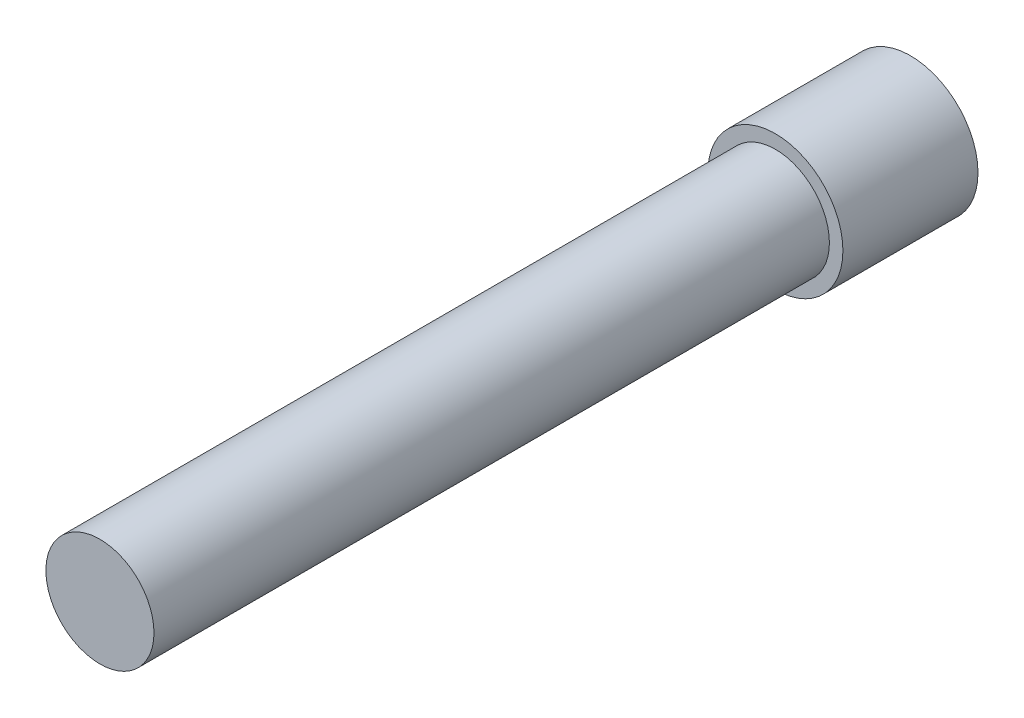
ISO-10303-21;
HEADER;
FILE_DESCRIPTION(('STEP AP214'),'2;1');
FILE_NAME('part.step','',(''),(''),'','','');
FILE_SCHEMA(('AUTOMOTIVE_DESIGN { 1 0 10303 214 1 1 1 1 }'));
ENDSEC;
DATA;
#1=APPLICATION_CONTEXT('core data for automotive mechanical design processes');
#2=APPLICATION_PROTOCOL_DEFINITION('international standard','automotive_design',2000,#1);
#3=PRODUCT_CONTEXT('',#1,'mechanical');
#4=PRODUCT('Part','Part','',(#3));
#5=PRODUCT_RELATED_PRODUCT_CATEGORY('part','',(#4));
#6=PRODUCT_DEFINITION_FORMATION('','',#4);
#7=PRODUCT_DEFINITION_CONTEXT('part definition',#1,'design');
#8=PRODUCT_DEFINITION('design','',#6,#7);
#9=PRODUCT_DEFINITION_SHAPE('','',#8);
#10=(LENGTH_UNIT() NAMED_UNIT(*) SI_UNIT(.MILLI.,.METRE.));
#11=(NAMED_UNIT(*) PLANE_ANGLE_UNIT() SI_UNIT($,.RADIAN.));
#12=(NAMED_UNIT(*) SI_UNIT($,.STERADIAN.) SOLID_ANGLE_UNIT());
#13=UNCERTAINTY_MEASURE_WITH_UNIT(LENGTH_MEASURE(1.E-05),#10,'distance_accuracy_value','');
#14=(GEOMETRIC_REPRESENTATION_CONTEXT(3) GLOBAL_UNCERTAINTY_ASSIGNED_CONTEXT((#13)) GLOBAL_UNIT_ASSIGNED_CONTEXT((#10,
#11,#12)) REPRESENTATION_CONTEXT('',''));
#15=CARTESIAN_POINT('',(0.,0.,0.));
#16=DIRECTION('',(0.,0.,1.));
#17=DIRECTION('',(1.,0.,0.));
#18=AXIS2_PLACEMENT_3D('',#15,#16,#17);
#19=CARTESIAN_POINT('',(0.,0.,0.));
#20=DIRECTION('',(0.,0.,1.));
#21=DIRECTION('',(1.,0.,0.));
#22=AXIS2_PLACEMENT_3D('',#19,#20,#21);
#23=PLANE('',#22);
#24=CARTESIAN_POINT('',(0.,0.,0.));
#25=DIRECTION('',(0.,0.,1.));
#26=DIRECTION('',(1.,0.,0.));
#27=AXIS2_PLACEMENT_3D('',#24,#25,#26);
#28=CIRCLE('',#27,4.);
#29=CARTESIAN_POINT('',(4.,0.,0.));
#30=VERTEX_POINT('',#29);
#31=EDGE_CURVE('E10',#30,#30,#28,.T.);
#32=ORIENTED_EDGE('',*,*,#31,.T.);
#33=EDGE_LOOP('',(#32));
#34=FACE_BOUND('',#33,.T.);
#35=ADVANCED_FACE('F40',(#34),#23,.T.);
#36=CARTESIAN_POINT('',(0.,0.,0.));
#37=DIRECTION('',(0.,0.,1.));
#38=DIRECTION('',(1.,0.,0.));
#39=AXIS2_PLACEMENT_3D('',#36,#37,#38);
#40=CYLINDRICAL_SURFACE('',#39,4.);
#41=CARTESIAN_POINT('',(0.,0.,-50.));
#42=DIRECTION('',(0.,0.,1.));
#43=DIRECTION('',(1.,0.,0.));
#44=AXIS2_PLACEMENT_3D('',#41,#42,#43);
#45=CIRCLE('',#44,4.);
#46=CARTESIAN_POINT('',(4.,0.,-50.));
#47=VERTEX_POINT('',#46);
#48=EDGE_CURVE('E43',#47,#47,#45,.T.);
#49=ORIENTED_EDGE('',*,*,#48,.T.);
#50=EDGE_LOOP('',(#49));
#51=FACE_BOUND('',#50,.T.);
#52=ORIENTED_EDGE('',*,*,#31,.F.);
#53=EDGE_LOOP('',(#52));
#54=FACE_BOUND('',#53,.T.);
#55=ADVANCED_FACE('F66',(#51,#54),#40,.T.);
#56=CARTESIAN_POINT('',(4.,0.,-50.));
#57=DIRECTION('',(0.,0.,1.));
#58=DIRECTION('',(1.,0.,0.));
#59=AXIS2_PLACEMENT_3D('',#56,#57,#58);
#60=PLANE('',#59);
#61=CARTESIAN_POINT('',(0.,0.,-50.));
#62=DIRECTION('',(0.,0.,1.));
#63=DIRECTION('',(1.,0.,0.));
#64=AXIS2_PLACEMENT_3D('',#61,#62,#63);
#65=CIRCLE('',#64,5.);
#66=CARTESIAN_POINT('',(5.,0.,-50.));
#67=VERTEX_POINT('',#66);
#68=EDGE_CURVE('E50',#67,#67,#65,.T.);
#69=ORIENTED_EDGE('',*,*,#68,.T.);
#70=EDGE_LOOP('',(#69));
#71=FACE_BOUND('',#70,.T.);
#72=ORIENTED_EDGE('',*,*,#48,.F.);
#73=EDGE_LOOP('',(#72));
#74=FACE_BOUND('',#73,.T.);
#75=ADVANCED_FACE('F67',(#71,#74),#60,.T.);
#76=CARTESIAN_POINT('',(0.,0.,0.));
#77=DIRECTION('',(0.,0.,1.));
#78=DIRECTION('',(1.,0.,0.));
#79=AXIS2_PLACEMENT_3D('',#76,#77,#78);
#80=CYLINDRICAL_SURFACE('',#79,5.);
#81=CARTESIAN_POINT('',(0.,0.,-60.));
#82=DIRECTION('',(0.,0.,1.));
#83=DIRECTION('',(1.,0.,0.));
#84=AXIS2_PLACEMENT_3D('',#81,#82,#83);
#85=CIRCLE('',#84,5.);
#86=CARTESIAN_POINT('',(5.,0.,-60.));
#87=VERTEX_POINT('',#86);
#88=EDGE_CURVE('E51',#87,#87,#85,.T.);
#89=ORIENTED_EDGE('',*,*,#88,.T.);
#90=EDGE_LOOP('',(#89));
#91=FACE_BOUND('',#90,.T.);
#92=ORIENTED_EDGE('',*,*,#68,.F.);
#93=EDGE_LOOP('',(#92));
#94=FACE_BOUND('',#93,.T.);
#95=ADVANCED_FACE('F60',(#91,#94),#80,.T.);
#96=CARTESIAN_POINT('',(5.,0.,-60.));
#97=DIRECTION('',(0.,0.,-1.));
#98=DIRECTION('',(-1.,0.,0.));
#99=AXIS2_PLACEMENT_3D('',#96,#97,#98);
#100=PLANE('',#99);
#101=ORIENTED_EDGE('',*,*,#88,.F.);
#102=EDGE_LOOP('',(#101));
#103=FACE_BOUND('',#102,.T.);
#104=ADVANCED_FACE('F58',(#103),#100,.T.);
#105=CLOSED_SHELL('',(#35,#55,#75,#95,#104));
#106=MANIFOLD_SOLID_BREP('B2',#105);
#107=ADVANCED_BREP_SHAPE_REPRESENTATION('',(#18,#106),#14);
#108=SHAPE_DEFINITION_REPRESENTATION(#9,#107);
ENDSEC;
END-ISO-10303-21;
